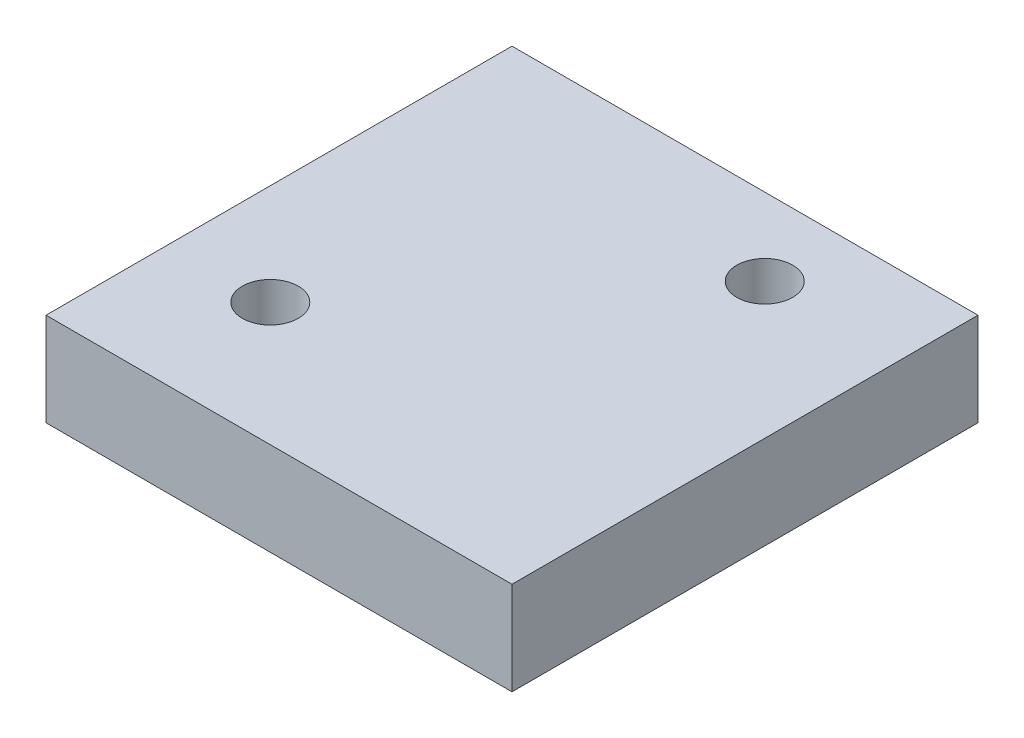
ISO-10303-21;
HEADER;
FILE_DESCRIPTION(('STEP AP214'),'2;1');
FILE_NAME('part.step','',(''),(''),'','','');
FILE_SCHEMA(('AUTOMOTIVE_DESIGN { 1 0 10303 214 1 1 1 1 }'));
ENDSEC;
DATA;
#1=APPLICATION_CONTEXT('core data for automotive mechanical design processes');
#2=APPLICATION_PROTOCOL_DEFINITION('international standard','automotive_design',2000,#1);
#3=PRODUCT_CONTEXT('',#1,'mechanical');
#4=PRODUCT('Part','Part','',(#3));
#5=PRODUCT_RELATED_PRODUCT_CATEGORY('part','',(#4));
#6=PRODUCT_DEFINITION_FORMATION('','',#4);
#7=PRODUCT_DEFINITION_CONTEXT('part definition',#1,'design');
#8=PRODUCT_DEFINITION('design','',#6,#7);
#9=PRODUCT_DEFINITION_SHAPE('','',#8);
#10=(LENGTH_UNIT() NAMED_UNIT(*) SI_UNIT(.MILLI.,.METRE.));
#11=(NAMED_UNIT(*) PLANE_ANGLE_UNIT() SI_UNIT($,.RADIAN.));
#12=(NAMED_UNIT(*) SI_UNIT($,.STERADIAN.) SOLID_ANGLE_UNIT());
#13=UNCERTAINTY_MEASURE_WITH_UNIT(LENGTH_MEASURE(1.E-05),#10,'distance_accuracy_value','');
#14=(GEOMETRIC_REPRESENTATION_CONTEXT(3) GLOBAL_UNCERTAINTY_ASSIGNED_CONTEXT((#13)) GLOBAL_UNIT_ASSIGNED_CONTEXT((#10,
#11,#12)) REPRESENTATION_CONTEXT('',''));
#15=CARTESIAN_POINT('',(0.,0.,0.));
#16=DIRECTION('',(0.,0.,1.));
#17=DIRECTION('',(1.,0.,0.));
#18=AXIS2_PLACEMENT_3D('',#15,#16,#17);
#19=CARTESIAN_POINT('',(0.,20.,0.));
#20=DIRECTION('',(1.,0.,0.));
#21=DIRECTION('',(0.,0.,-1.));
#22=AXIS2_PLACEMENT_3D('',#19,#20,#21);
#23=PLANE('',#22);
#24=DIRECTION('',(0.,0.,1.));
#25=VECTOR('',#24,1.);
#26=CARTESIAN_POINT('',(0.,0.,0.));
#27=LINE('',#26,#25);
#28=CARTESIAN_POINT('',(0.,0.,-100.));
#29=VERTEX_POINT('',#28);
#30=CARTESIAN_POINT('',(0.,0.,0.));
#31=VERTEX_POINT('',#30);
#32=EDGE_CURVE('E107',#29,#31,#27,.T.);
#33=ORIENTED_EDGE('',*,*,#32,.T.);
#34=DIRECTION('',(0.,-1.,0.));
#35=VECTOR('',#34,1.);
#36=CARTESIAN_POINT('',(0.,20.,0.));
#37=LINE('',#36,#35);
#38=CARTESIAN_POINT('',(0.,20.,0.));
#39=VERTEX_POINT('',#38);
#40=EDGE_CURVE('E11',#39,#31,#37,.T.);
#41=ORIENTED_EDGE('',*,*,#40,.F.);
#42=DIRECTION('',(0.,0.,1.));
#43=VECTOR('',#42,1.);
#44=CARTESIAN_POINT('',(0.,20.,0.));
#45=LINE('',#44,#43);
#46=CARTESIAN_POINT('',(0.,20.,-100.));
#47=VERTEX_POINT('',#46);
#48=EDGE_CURVE('E91',#47,#39,#45,.T.);
#49=ORIENTED_EDGE('',*,*,#48,.F.);
#50=DIRECTION('',(0.,-1.,0.));
#51=VECTOR('',#50,1.);
#52=CARTESIAN_POINT('',(0.,20.,-100.));
#53=LINE('',#52,#51);
#54=EDGE_CURVE('E103',#47,#29,#53,.T.);
#55=ORIENTED_EDGE('',*,*,#54,.T.);
#56=EDGE_LOOP('',(#33,#41,#49,#55));
#57=FACE_BOUND('',#56,.T.);
#58=ADVANCED_FACE('F39',(#57),#23,.F.);
#59=CARTESIAN_POINT('',(0.,20.,0.));
#60=DIRECTION('',(0.,0.,-1.));
#61=DIRECTION('',(-1.,0.,0.));
#62=AXIS2_PLACEMENT_3D('',#59,#60,#61);
#63=PLANE('',#62);
#64=DIRECTION('',(1.,0.,0.));
#65=VECTOR('',#64,1.);
#66=CARTESIAN_POINT('',(0.,0.,0.));
#67=LINE('',#66,#65);
#68=CARTESIAN_POINT('',(100.,0.,0.));
#69=VERTEX_POINT('',#68);
#70=EDGE_CURVE('E96',#31,#69,#67,.T.);
#71=ORIENTED_EDGE('',*,*,#70,.T.);
#72=DIRECTION('',(0.,-1.,0.));
#73=VECTOR('',#72,1.);
#74=CARTESIAN_POINT('',(100.,20.,0.));
#75=LINE('',#74,#73);
#76=CARTESIAN_POINT('',(100.,20.,0.));
#77=VERTEX_POINT('',#76);
#78=EDGE_CURVE('E48',#77,#69,#75,.T.);
#79=ORIENTED_EDGE('',*,*,#78,.F.);
#80=DIRECTION('',(1.,0.,0.));
#81=VECTOR('',#80,1.);
#82=CARTESIAN_POINT('',(0.,20.,0.));
#83=LINE('',#82,#81);
#84=EDGE_CURVE('E86',#39,#77,#83,.T.);
#85=ORIENTED_EDGE('',*,*,#84,.F.);
#86=ORIENTED_EDGE('',*,*,#40,.T.);
#87=EDGE_LOOP('',(#71,#79,#85,#86));
#88=FACE_BOUND('',#87,.T.);
#89=ADVANCED_FACE('F95',(#88),#63,.F.);
#90=CARTESIAN_POINT('',(100.,20.,0.));
#91=DIRECTION('',(-1.,0.,0.));
#92=DIRECTION('',(0.,0.,1.));
#93=AXIS2_PLACEMENT_3D('',#90,#91,#92);
#94=PLANE('',#93);
#95=DIRECTION('',(0.,0.,-1.));
#96=VECTOR('',#95,1.);
#97=CARTESIAN_POINT('',(100.,0.,0.));
#98=LINE('',#97,#96);
#99=CARTESIAN_POINT('',(100.,0.,-100.));
#100=VERTEX_POINT('',#99);
#101=EDGE_CURVE('E73',#69,#100,#98,.T.);
#102=ORIENTED_EDGE('',*,*,#101,.T.);
#103=DIRECTION('',(0.,-1.,0.));
#104=VECTOR('',#103,1.);
#105=CARTESIAN_POINT('',(100.,20.,-100.));
#106=LINE('',#105,#104);
#107=CARTESIAN_POINT('',(100.,20.,-100.));
#108=VERTEX_POINT('',#107);
#109=EDGE_CURVE('E98',#108,#100,#106,.T.);
#110=ORIENTED_EDGE('',*,*,#109,.F.);
#111=DIRECTION('',(0.,0.,-1.));
#112=VECTOR('',#111,1.);
#113=CARTESIAN_POINT('',(100.,20.,0.));
#114=LINE('',#113,#112);
#115=EDGE_CURVE('E89',#77,#108,#114,.T.);
#116=ORIENTED_EDGE('',*,*,#115,.F.);
#117=ORIENTED_EDGE('',*,*,#78,.T.);
#118=EDGE_LOOP('',(#102,#110,#116,#117));
#119=FACE_BOUND('',#118,.T.);
#120=ADVANCED_FACE('F99',(#119),#94,.F.);
#121=CARTESIAN_POINT('',(0.,20.,-100.));
#122=DIRECTION('',(0.,0.,1.));
#123=DIRECTION('',(1.,0.,0.));
#124=AXIS2_PLACEMENT_3D('',#121,#122,#123);
#125=PLANE('',#124);
#126=DIRECTION('',(-1.,0.,0.));
#127=VECTOR('',#126,1.);
#128=CARTESIAN_POINT('',(0.,0.,-100.));
#129=LINE('',#128,#127);
#130=EDGE_CURVE('E79',#100,#29,#129,.T.);
#131=ORIENTED_EDGE('',*,*,#130,.T.);
#132=ORIENTED_EDGE('',*,*,#54,.F.);
#133=DIRECTION('',(-1.,0.,0.));
#134=VECTOR('',#133,1.);
#135=CARTESIAN_POINT('',(0.,20.,-100.));
#136=LINE('',#135,#134);
#137=EDGE_CURVE('E56',#108,#47,#136,.T.);
#138=ORIENTED_EDGE('',*,*,#137,.F.);
#139=ORIENTED_EDGE('',*,*,#109,.T.);
#140=EDGE_LOOP('',(#131,#132,#138,#139));
#141=FACE_BOUND('',#140,.T.);
#142=ADVANCED_FACE('F121',(#141),#125,.F.);
#143=CARTESIAN_POINT('',(0.,20.,0.));
#144=DIRECTION('',(0.,-1.,0.));
#145=DIRECTION('',(0.,0.,-1.));
#146=AXIS2_PLACEMENT_3D('',#143,#144,#145);
#147=PLANE('',#146);
#148=CARTESIAN_POINT('',(21.6607425052757,20.,-26.4704950808436));
#149=DIRECTION('',(0.,1.,0.));
#150=DIRECTION('',(0.,0.,1.));
#151=AXIS2_PLACEMENT_3D('',#148,#149,#150);
#152=CIRCLE('',#151,6.);
#153=CARTESIAN_POINT('',(21.6607425052757,20.,-20.4704950808436));
#154=VERTEX_POINT('',#153);
#155=EDGE_CURVE('E139',#154,#154,#152,.T.);
#156=ORIENTED_EDGE('',*,*,#155,.F.);
#157=EDGE_LOOP('',(#156));
#158=FACE_BOUND('',#157,.T.);
#159=CARTESIAN_POINT('',(70.8142523423021,20.,-83.4210736281875));
#160=DIRECTION('',(0.,1.,0.));
#161=DIRECTION('',(0.,0.,1.));
#162=AXIS2_PLACEMENT_3D('',#159,#160,#161);
#163=CIRCLE('',#162,6.00000000000001);
#164=CARTESIAN_POINT('',(70.8142523423021,20.,-77.4210736281875));
#165=VERTEX_POINT('',#164);
#166=EDGE_CURVE('E131',#165,#165,#163,.T.);
#167=ORIENTED_EDGE('',*,*,#166,.F.);
#168=EDGE_LOOP('',(#167));
#169=FACE_BOUND('',#168,.T.);
#170=ORIENTED_EDGE('',*,*,#48,.T.);
#171=ORIENTED_EDGE('',*,*,#84,.T.);
#172=ORIENTED_EDGE('',*,*,#115,.T.);
#173=ORIENTED_EDGE('',*,*,#137,.T.);
#174=EDGE_LOOP('',(#170,#171,#172,#173));
#175=FACE_BOUND('',#174,.T.);
#176=ADVANCED_FACE('F87',(#158,#169,#175),#147,.F.);
#177=CARTESIAN_POINT('',(0.,0.,0.));
#178=DIRECTION('',(0.,-1.,0.));
#179=DIRECTION('',(0.,0.,-1.));
#180=AXIS2_PLACEMENT_3D('',#177,#178,#179);
#181=PLANE('',#180);
#182=CARTESIAN_POINT('',(21.6607425052757,0.,-26.4704950808436));
#183=DIRECTION('',(0.,1.,0.));
#184=DIRECTION('',(0.,0.,1.));
#185=AXIS2_PLACEMENT_3D('',#182,#183,#184);
#186=CIRCLE('',#185,6.);
#187=CARTESIAN_POINT('',(21.6607425052757,0.,-20.4704950808436));
#188=VERTEX_POINT('',#187);
#189=EDGE_CURVE('E135',#188,#188,#186,.T.);
#190=ORIENTED_EDGE('',*,*,#189,.T.);
#191=EDGE_LOOP('',(#190));
#192=FACE_BOUND('',#191,.T.);
#193=CARTESIAN_POINT('',(70.8142523423021,0.,-83.4210736281875));
#194=DIRECTION('',(0.,1.,0.));
#195=DIRECTION('',(0.,0.,1.));
#196=AXIS2_PLACEMENT_3D('',#193,#194,#195);
#197=CIRCLE('',#196,5.99999999999999);
#198=CARTESIAN_POINT('',(70.8142523423021,0.,-77.4210736281875));
#199=VERTEX_POINT('',#198);
#200=EDGE_CURVE('E111',#199,#199,#197,.T.);
#201=ORIENTED_EDGE('',*,*,#200,.T.);
#202=EDGE_LOOP('',(#201));
#203=FACE_BOUND('',#202,.T.);
#204=ORIENTED_EDGE('',*,*,#32,.F.);
#205=ORIENTED_EDGE('',*,*,#130,.F.);
#206=ORIENTED_EDGE('',*,*,#101,.F.);
#207=ORIENTED_EDGE('',*,*,#70,.F.);
#208=EDGE_LOOP('',(#204,#205,#206,#207));
#209=FACE_BOUND('',#208,.T.);
#210=ADVANCED_FACE('F124',(#192,#203,#209),#181,.T.);
#211=CARTESIAN_POINT('',(70.8142523423021,20.,-83.4210736281875));
#212=DIRECTION('',(0.,1.,0.));
#213=DIRECTION('',(0.,0.,1.));
#214=AXIS2_PLACEMENT_3D('',#211,#212,#213);
#215=CYLINDRICAL_SURFACE('',#214,6.);
#216=ORIENTED_EDGE('',*,*,#200,.F.);
#217=EDGE_LOOP('',(#216));
#218=FACE_BOUND('',#217,.T.);
#219=ORIENTED_EDGE('',*,*,#166,.T.);
#220=EDGE_LOOP('',(#219));
#221=FACE_BOUND('',#220,.T.);
#222=ADVANCED_FACE('F151',(#218,#221),#215,.F.);
#223=CARTESIAN_POINT('',(21.6607425052757,20.,-26.4704950808436));
#224=DIRECTION('',(0.,1.,0.));
#225=DIRECTION('',(0.,0.,1.));
#226=AXIS2_PLACEMENT_3D('',#223,#224,#225);
#227=CYLINDRICAL_SURFACE('',#226,6.);
#228=ORIENTED_EDGE('',*,*,#189,.F.);
#229=EDGE_LOOP('',(#228));
#230=FACE_BOUND('',#229,.T.);
#231=ORIENTED_EDGE('',*,*,#155,.T.);
#232=EDGE_LOOP('',(#231));
#233=FACE_BOUND('',#232,.T.);
#234=ADVANCED_FACE('F144',(#230,#233),#227,.F.);
#235=CLOSED_SHELL('',(#58,#89,#120,#142,#176,#210,#222,#234));
#236=MANIFOLD_SOLID_BREP('B2',#235);
#237=ADVANCED_BREP_SHAPE_REPRESENTATION('',(#18,#236),#14);
#238=SHAPE_DEFINITION_REPRESENTATION(#9,#237);
ENDSEC;
END-ISO-10303-21;
